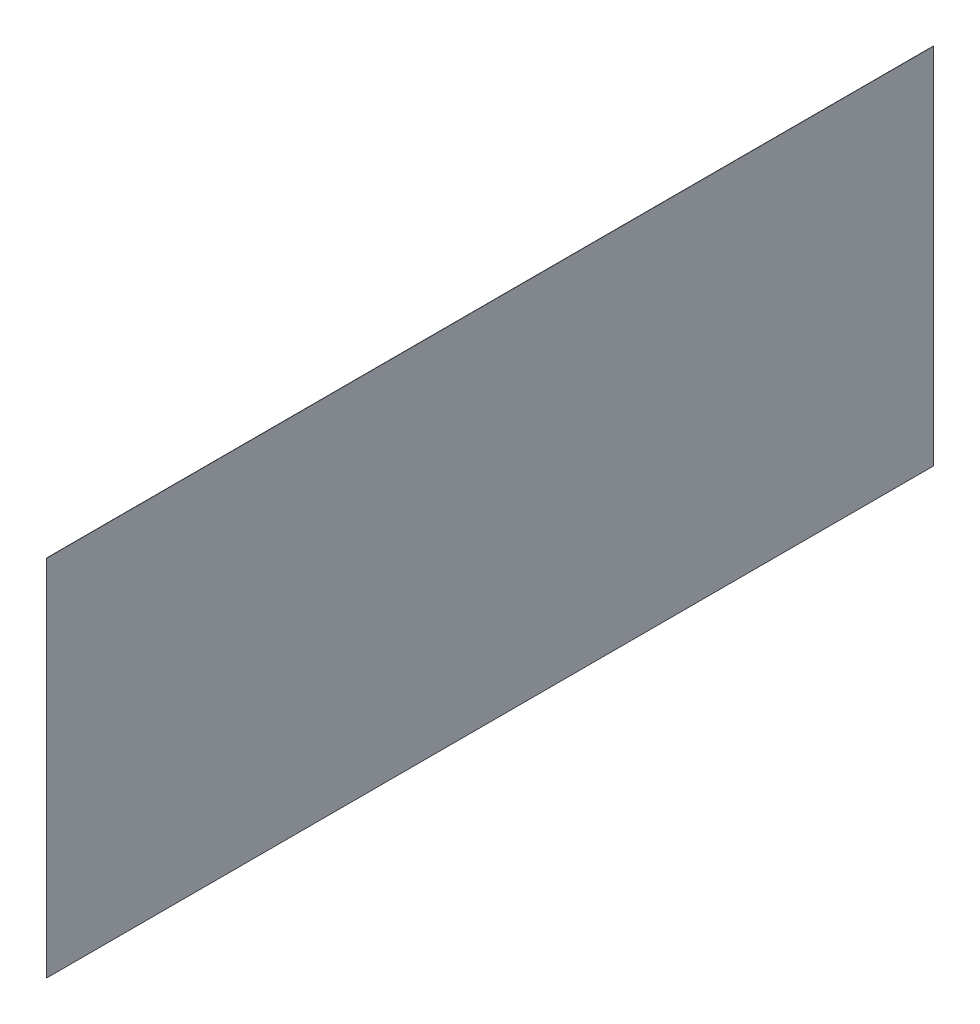
ISO-10303-21;
HEADER;
FILE_DESCRIPTION(('STEP AP214'),'2;1');
FILE_NAME('part.step','',(''),(''),'','','');
FILE_SCHEMA(('AUTOMOTIVE_DESIGN { 1 0 10303 214 1 1 1 1 }'));
ENDSEC;
DATA;
#1=APPLICATION_CONTEXT('core data for automotive mechanical design processes');
#2=APPLICATION_PROTOCOL_DEFINITION('international standard','automotive_design',2000,#1);
#3=PRODUCT_CONTEXT('',#1,'mechanical');
#4=PRODUCT('Part','Part','',(#3));
#5=PRODUCT_RELATED_PRODUCT_CATEGORY('part','',(#4));
#6=PRODUCT_DEFINITION_FORMATION('','',#4);
#7=PRODUCT_DEFINITION_CONTEXT('part definition',#1,'design');
#8=PRODUCT_DEFINITION('design','',#6,#7);
#9=PRODUCT_DEFINITION_SHAPE('','',#8);
#10=(LENGTH_UNIT() NAMED_UNIT(*) SI_UNIT(.MILLI.,.METRE.));
#11=(NAMED_UNIT(*) PLANE_ANGLE_UNIT() SI_UNIT($,.RADIAN.));
#12=(NAMED_UNIT(*) SI_UNIT($,.STERADIAN.) SOLID_ANGLE_UNIT());
#13=UNCERTAINTY_MEASURE_WITH_UNIT(LENGTH_MEASURE(1.E-05),#10,'distance_accuracy_value','');
#14=(GEOMETRIC_REPRESENTATION_CONTEXT(3) GLOBAL_UNCERTAINTY_ASSIGNED_CONTEXT((#13)) GLOBAL_UNIT_ASSIGNED_CONTEXT((#10,
#11,#12)) REPRESENTATION_CONTEXT('',''));
#15=CARTESIAN_POINT('',(0.,0.,0.));
#16=DIRECTION('',(0.,0.,1.));
#17=DIRECTION('',(1.,0.,0.));
#18=AXIS2_PLACEMENT_3D('',#15,#16,#17);
#19=CARTESIAN_POINT('',(-126.4032,60.,-150.));
#20=DIRECTION('',(0.,0.,-1.));
#21=DIRECTION('',(-1.,0.,0.));
#22=AXIS2_PLACEMENT_3D('',#19,#20,#21);
#23=PLANE('',#22);
#24=DIRECTION('',(0.,1.,0.));
#25=VECTOR('',#24,1.);
#26=CARTESIAN_POINT('',(-126.327,60.,-150.));
#27=LINE('',#26,#25);
#28=CARTESIAN_POINT('',(-126.327,-60.,-150.));
#29=VERTEX_POINT('',#28);
#30=CARTESIAN_POINT('',(-126.327,63.,-150.));
#31=VERTEX_POINT('',#30);
#32=EDGE_CURVE('E107',#29,#31,#27,.T.);
#33=ORIENTED_EDGE('',*,*,#32,.F.);
#34=DIRECTION('',(1.,0.,0.));
#35=VECTOR('',#34,1.);
#36=CARTESIAN_POINT('',(-126.4032,-60.,-150.));
#37=LINE('',#36,#35);
#38=CARTESIAN_POINT('',(-126.4032,-60.,-150.));
#39=VERTEX_POINT('',#38);
#40=EDGE_CURVE('E11',#39,#29,#37,.T.);
#41=ORIENTED_EDGE('',*,*,#40,.F.);
#42=DIRECTION('',(0.,1.,0.));
#43=VECTOR('',#42,1.);
#44=CARTESIAN_POINT('',(-126.4032,63.,-150.));
#45=LINE('',#44,#43);
#46=CARTESIAN_POINT('',(-126.4032,63.,-150.));
#47=VERTEX_POINT('',#46);
#48=EDGE_CURVE('E66',#39,#47,#45,.T.);
#49=ORIENTED_EDGE('',*,*,#48,.T.);
#50=DIRECTION('',(1.,0.,0.));
#51=VECTOR('',#50,1.);
#52=CARTESIAN_POINT('',(-126.4032,63.,-150.));
#53=LINE('',#52,#51);
#54=EDGE_CURVE('E51',#47,#31,#53,.T.);
#55=ORIENTED_EDGE('',*,*,#54,.T.);
#56=EDGE_LOOP('',(#33,#41,#49,#55));
#57=FACE_BOUND('',#56,.T.);
#58=ADVANCED_FACE('F47',(#57),#23,.T.);
#59=CARTESIAN_POINT('',(-126.4032,-60.,150.));
#60=DIRECTION('',(0.,-1.,0.));
#61=DIRECTION('',(0.,0.,-1.));
#62=AXIS2_PLACEMENT_3D('',#59,#60,#61);
#63=PLANE('',#62);
#64=DIRECTION('',(0.,0.,-1.));
#65=VECTOR('',#64,1.);
#66=CARTESIAN_POINT('',(-126.327,-60.,150.));
#67=LINE('',#66,#65);
#68=CARTESIAN_POINT('',(-126.327,-60.,150.));
#69=VERTEX_POINT('',#68);
#70=EDGE_CURVE('E114',#69,#29,#67,.T.);
#71=ORIENTED_EDGE('',*,*,#70,.F.);
#72=DIRECTION('',(1.,0.,0.));
#73=VECTOR('',#72,1.);
#74=CARTESIAN_POINT('',(-126.4032,-60.,150.));
#75=LINE('',#74,#73);
#76=CARTESIAN_POINT('',(-126.4032,-60.,150.));
#77=VERTEX_POINT('',#76);
#78=EDGE_CURVE('E57',#77,#69,#75,.T.);
#79=ORIENTED_EDGE('',*,*,#78,.F.);
#80=DIRECTION('',(0.,0.,-1.));
#81=VECTOR('',#80,1.);
#82=CARTESIAN_POINT('',(-126.4032,-60.,150.));
#83=LINE('',#82,#81);
#84=EDGE_CURVE('E104',#77,#39,#83,.T.);
#85=ORIENTED_EDGE('',*,*,#84,.T.);
#86=ORIENTED_EDGE('',*,*,#40,.T.);
#87=EDGE_LOOP('',(#71,#79,#85,#86));
#88=FACE_BOUND('',#87,.T.);
#89=ADVANCED_FACE('F121',(#88),#63,.T.);
#90=CARTESIAN_POINT('',(-126.4032,60.,150.));
#91=DIRECTION('',(0.,0.,1.));
#92=DIRECTION('',(1.,0.,0.));
#93=AXIS2_PLACEMENT_3D('',#90,#91,#92);
#94=PLANE('',#93);
#95=DIRECTION('',(0.,-1.,0.));
#96=VECTOR('',#95,1.);
#97=CARTESIAN_POINT('',(-126.327,60.,150.));
#98=LINE('',#97,#96);
#99=CARTESIAN_POINT('',(-126.327,63.,150.));
#100=VERTEX_POINT('',#99);
#101=EDGE_CURVE('E100',#100,#69,#98,.T.);
#102=ORIENTED_EDGE('',*,*,#101,.F.);
#103=DIRECTION('',(1.,0.,0.));
#104=VECTOR('',#103,1.);
#105=CARTESIAN_POINT('',(-126.4032,63.,150.));
#106=LINE('',#105,#104);
#107=CARTESIAN_POINT('',(-126.4032,63.,150.));
#108=VERTEX_POINT('',#107);
#109=EDGE_CURVE('E95',#108,#100,#106,.T.);
#110=ORIENTED_EDGE('',*,*,#109,.F.);
#111=DIRECTION('',(0.,-1.,0.));
#112=VECTOR('',#111,1.);
#113=CARTESIAN_POINT('',(-126.4032,60.,150.));
#114=LINE('',#113,#112);
#115=EDGE_CURVE('E98',#108,#77,#114,.T.);
#116=ORIENTED_EDGE('',*,*,#115,.T.);
#117=ORIENTED_EDGE('',*,*,#78,.T.);
#118=EDGE_LOOP('',(#102,#110,#116,#117));
#119=FACE_BOUND('',#118,.T.);
#120=ADVANCED_FACE('F97',(#119),#94,.T.);
#121=CARTESIAN_POINT('',(-126.4032,63.,150.));
#122=DIRECTION('',(0.,1.,0.));
#123=DIRECTION('',(0.,0.,1.));
#124=AXIS2_PLACEMENT_3D('',#121,#122,#123);
#125=PLANE('',#124);
#126=DIRECTION('',(0.,0.,1.));
#127=VECTOR('',#126,1.);
#128=CARTESIAN_POINT('',(-126.327,63.,150.));
#129=LINE('',#128,#127);
#130=EDGE_CURVE('E111',#31,#100,#129,.T.);
#131=ORIENTED_EDGE('',*,*,#130,.F.);
#132=ORIENTED_EDGE('',*,*,#54,.F.);
#133=DIRECTION('',(0.,0.,1.));
#134=VECTOR('',#133,1.);
#135=CARTESIAN_POINT('',(-126.4032,63.,150.));
#136=LINE('',#135,#134);
#137=EDGE_CURVE('E103',#47,#108,#136,.T.);
#138=ORIENTED_EDGE('',*,*,#137,.T.);
#139=ORIENTED_EDGE('',*,*,#109,.T.);
#140=EDGE_LOOP('',(#131,#132,#138,#139));
#141=FACE_BOUND('',#140,.T.);
#142=ADVANCED_FACE('F49',(#141),#125,.T.);
#143=CARTESIAN_POINT('',(-126.4032,0.,0.));
#144=DIRECTION('',(1.,0.,0.));
#145=DIRECTION('',(0.,0.,-1.));
#146=AXIS2_PLACEMENT_3D('',#143,#144,#145);
#147=PLANE('',#146);
#148=ORIENTED_EDGE('',*,*,#48,.F.);
#149=ORIENTED_EDGE('',*,*,#84,.F.);
#150=ORIENTED_EDGE('',*,*,#115,.F.);
#151=ORIENTED_EDGE('',*,*,#137,.F.);
#152=EDGE_LOOP('',(#148,#149,#150,#151));
#153=FACE_BOUND('',#152,.T.);
#154=ADVANCED_FACE('F102',(#153),#147,.F.);
#155=CARTESIAN_POINT('',(-126.327,0.,0.));
#156=DIRECTION('',(1.,0.,0.));
#157=DIRECTION('',(0.,0.,-1.));
#158=AXIS2_PLACEMENT_3D('',#155,#156,#157);
#159=PLANE('',#158);
#160=ORIENTED_EDGE('',*,*,#32,.T.);
#161=ORIENTED_EDGE('',*,*,#130,.T.);
#162=ORIENTED_EDGE('',*,*,#101,.T.);
#163=ORIENTED_EDGE('',*,*,#70,.T.);
#164=EDGE_LOOP('',(#160,#161,#162,#163));
#165=FACE_BOUND('',#164,.T.);
#166=ADVANCED_FACE('F119',(#165),#159,.T.);
#167=CLOSED_SHELL('',(#58,#89,#120,#142,#154,#166));
#168=MANIFOLD_SOLID_BREP('B2',#167);
#169=ADVANCED_BREP_SHAPE_REPRESENTATION('',(#18,#168),#14);
#170=SHAPE_DEFINITION_REPRESENTATION(#9,#169);
ENDSEC;
END-ISO-10303-21;
